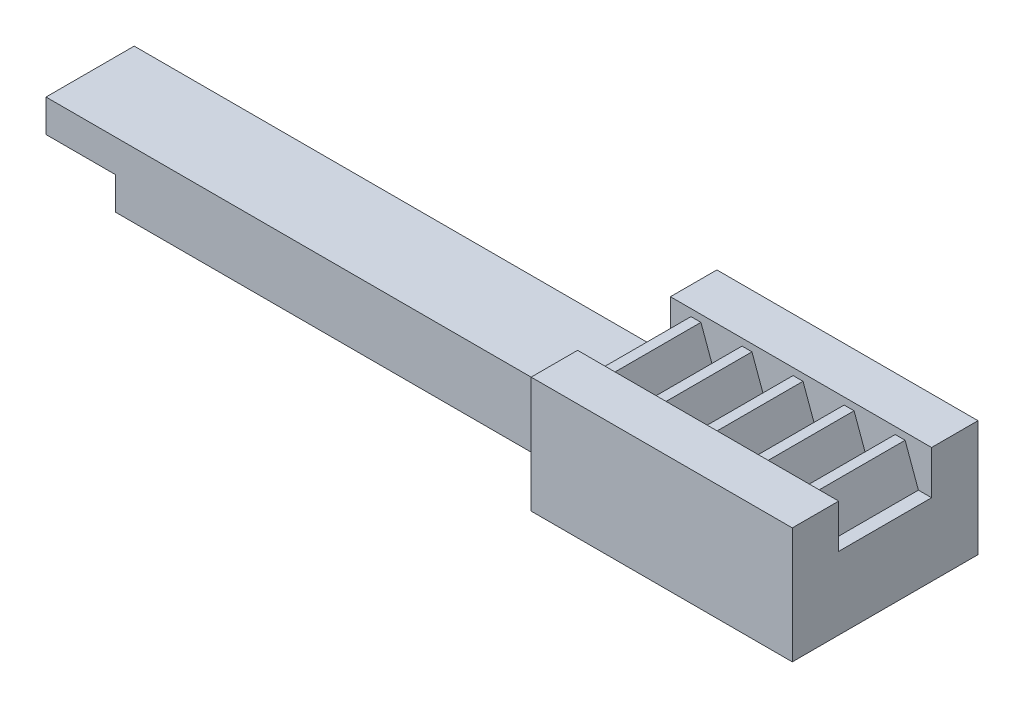
ISO-10303-21;
HEADER;
FILE_DESCRIPTION(('STEP AP214'),'2;1');
FILE_NAME('part.step','',(''),(''),'','','');
FILE_SCHEMA(('AUTOMOTIVE_DESIGN { 1 0 10303 214 1 1 1 1 }'));
ENDSEC;
DATA;
#1=APPLICATION_CONTEXT('core data for automotive mechanical design processes');
#2=APPLICATION_PROTOCOL_DEFINITION('international standard','automotive_design',2000,#1);
#3=PRODUCT_CONTEXT('',#1,'mechanical');
#4=PRODUCT('Part','Part','',(#3));
#5=PRODUCT_RELATED_PRODUCT_CATEGORY('part','',(#4));
#6=PRODUCT_DEFINITION_FORMATION('','',#4);
#7=PRODUCT_DEFINITION_CONTEXT('part definition',#1,'design');
#8=PRODUCT_DEFINITION('design','',#6,#7);
#9=PRODUCT_DEFINITION_SHAPE('','',#8);
#10=(LENGTH_UNIT() NAMED_UNIT(*) SI_UNIT(.MILLI.,.METRE.));
#11=(NAMED_UNIT(*) PLANE_ANGLE_UNIT() SI_UNIT($,.RADIAN.));
#12=(NAMED_UNIT(*) SI_UNIT($,.STERADIAN.) SOLID_ANGLE_UNIT());
#13=UNCERTAINTY_MEASURE_WITH_UNIT(LENGTH_MEASURE(1.E-05),#10,'distance_accuracy_value','');
#14=(GEOMETRIC_REPRESENTATION_CONTEXT(3) GLOBAL_UNCERTAINTY_ASSIGNED_CONTEXT((#13)) GLOBAL_UNIT_ASSIGNED_CONTEXT((#10,
#11,#12)) REPRESENTATION_CONTEXT('',''));
#15=CARTESIAN_POINT('',(0.,0.,0.));
#16=DIRECTION('',(0.,0.,1.));
#17=DIRECTION('',(1.,0.,0.));
#18=AXIS2_PLACEMENT_3D('',#15,#16,#17);
#19=CARTESIAN_POINT('',(0.,0.,-8.));
#20=DIRECTION('',(-1.,0.,0.));
#21=DIRECTION('',(0.,0.,1.));
#22=AXIS2_PLACEMENT_3D('',#19,#20,#21);
#23=PLANE('',#22);
#24=DIRECTION('',(0.,0.,1.));
#25=VECTOR('',#24,1.);
#26=CARTESIAN_POINT('',(0.,0.,-8.));
#27=LINE('',#26,#25);
#28=CARTESIAN_POINT('',(0.,0.,-8.));
#29=VERTEX_POINT('',#28);
#30=CARTESIAN_POINT('',(0.,0.,0.));
#31=VERTEX_POINT('',#30);
#32=EDGE_CURVE('E600',#29,#31,#27,.T.);
#33=ORIENTED_EDGE('',*,*,#32,.T.);
#34=DIRECTION('',(0.,-1.,0.));
#35=VECTOR('',#34,1.);
#36=CARTESIAN_POINT('',(0.,0.,0.));
#37=LINE('',#36,#35);
#38=CARTESIAN_POINT('',(0.,5.,0.));
#39=VERTEX_POINT('',#38);
#40=EDGE_CURVE('E591',#39,#31,#37,.T.);
#41=ORIENTED_EDGE('',*,*,#40,.F.);
#42=DIRECTION('',(0.,0.,-1.));
#43=VECTOR('',#42,1.);
#44=CARTESIAN_POINT('',(0.,5.,0.));
#45=LINE('',#44,#43);
#46=CARTESIAN_POINT('',(0.,5.,-2.));
#47=VERTEX_POINT('',#46);
#48=EDGE_CURVE('E329',#39,#47,#45,.T.);
#49=ORIENTED_EDGE('',*,*,#48,.T.);
#50=DIRECTION('',(0.,-1.,0.));
#51=VECTOR('',#50,1.);
#52=CARTESIAN_POINT('',(0.,5.,-2.));
#53=LINE('',#52,#51);
#54=CARTESIAN_POINT('',(0.,3.12499999999974,-2.));
#55=VERTEX_POINT('',#54);
#56=EDGE_CURVE('E341',#47,#55,#53,.T.);
#57=ORIENTED_EDGE('',*,*,#56,.T.);
#58=DIRECTION('',(0.,0.,1.));
#59=VECTOR('',#58,1.);
#60=CARTESIAN_POINT('',(0.,3.12499999999974,-8.));
#61=LINE('',#60,#59);
#62=CARTESIAN_POINT('',(0.,3.12499999999974,-6.));
#63=VERTEX_POINT('',#62);
#64=EDGE_CURVE('E583',#63,#55,#61,.T.);
#65=ORIENTED_EDGE('',*,*,#64,.F.);
#66=DIRECTION('',(0.,-1.,0.));
#67=VECTOR('',#66,1.);
#68=CARTESIAN_POINT('',(0.,5.,-6.));
#69=LINE('',#68,#67);
#70=CARTESIAN_POINT('',(0.,5.,-6.));
#71=VERTEX_POINT('',#70);
#72=EDGE_CURVE('E328',#71,#63,#69,.T.);
#73=ORIENTED_EDGE('',*,*,#72,.F.);
#74=DIRECTION('',(0.,0.,-1.));
#75=VECTOR('',#74,1.);
#76=CARTESIAN_POINT('',(0.,5.,-6.));
#77=LINE('',#76,#75);
#78=CARTESIAN_POINT('',(0.,5.,-8.));
#79=VERTEX_POINT('',#78);
#80=EDGE_CURVE('E352',#71,#79,#77,.T.);
#81=ORIENTED_EDGE('',*,*,#80,.T.);
#82=DIRECTION('',(0.,-1.,0.));
#83=VECTOR('',#82,1.);
#84=CARTESIAN_POINT('',(0.,0.,-8.));
#85=LINE('',#84,#83);
#86=EDGE_CURVE('E592',#79,#29,#85,.T.);
#87=ORIENTED_EDGE('',*,*,#86,.T.);
#88=EDGE_LOOP('',(#33,#41,#49,#57,#65,#73,#81,#87));
#89=FACE_BOUND('',#88,.T.);
#90=DIRECTION('',(0.,0.,1.));
#91=VECTOR('',#90,1.);
#92=CARTESIAN_POINT('',(0.,2.9,-2.1));
#93=LINE('',#92,#91);
#94=CARTESIAN_POINT('',(0.,2.9,-5.9));
#95=VERTEX_POINT('',#94);
#96=CARTESIAN_POINT('',(0.,2.9,-2.1));
#97=VERTEX_POINT('',#96);
#98=EDGE_CURVE('E1044',#95,#97,#93,.T.);
#99=ORIENTED_EDGE('',*,*,#98,.T.);
#100=DIRECTION('',(0.,-1.,0.));
#101=VECTOR('',#100,1.);
#102=CARTESIAN_POINT('',(0.,0.1,-2.1));
#103=LINE('',#102,#101);
#104=CARTESIAN_POINT('',(0.,0.1,-2.1));
#105=VERTEX_POINT('',#104);
#106=EDGE_CURVE('E68',#97,#105,#103,.T.);
#107=ORIENTED_EDGE('',*,*,#106,.T.);
#108=DIRECTION('',(0.,0.,-1.));
#109=VECTOR('',#108,1.);
#110=CARTESIAN_POINT('',(0.,0.1,-2.1));
#111=LINE('',#110,#109);
#112=CARTESIAN_POINT('',(0.,0.1,-5.9));
#113=VERTEX_POINT('',#112);
#114=EDGE_CURVE('E1050',#105,#113,#111,.T.);
#115=ORIENTED_EDGE('',*,*,#114,.T.);
#116=DIRECTION('',(0.,1.,0.));
#117=VECTOR('',#116,1.);
#118=CARTESIAN_POINT('',(0.,0.1,-5.9));
#119=LINE('',#118,#117);
#120=EDGE_CURVE('E290',#113,#95,#119,.T.);
#121=ORIENTED_EDGE('',*,*,#120,.T.);
#122=EDGE_LOOP('',(#99,#107,#115,#121));
#123=FACE_BOUND('',#122,.T.);
#124=ADVANCED_FACE('F45',(#89,#123),#23,.T.);
#125=CARTESIAN_POINT('',(0.,0.,-8.));
#126=DIRECTION('',(0.,-1.,0.));
#127=DIRECTION('',(0.,0.,-1.));
#128=AXIS2_PLACEMENT_3D('',#125,#126,#127);
#129=PLANE('',#128);
#130=DIRECTION('',(1.,0.,0.));
#131=VECTOR('',#130,1.);
#132=CARTESIAN_POINT('',(0.,0.,-8.));
#133=LINE('',#132,#131);
#134=CARTESIAN_POINT('',(11.25,0.,-8.));
#135=VERTEX_POINT('',#134);
#136=EDGE_CURVE('E595',#29,#135,#133,.T.);
#137=ORIENTED_EDGE('',*,*,#136,.T.);
#138=DIRECTION('',(0.,0.,1.));
#139=VECTOR('',#138,1.);
#140=CARTESIAN_POINT('',(11.25,0.,0.));
#141=LINE('',#140,#139);
#142=CARTESIAN_POINT('',(11.25,0.,0.));
#143=VERTEX_POINT('',#142);
#144=EDGE_CURVE('E307',#135,#143,#141,.T.);
#145=ORIENTED_EDGE('',*,*,#144,.T.);
#146=DIRECTION('',(1.,0.,0.));
#147=VECTOR('',#146,1.);
#148=CARTESIAN_POINT('',(0.,0.,0.));
#149=LINE('',#148,#147);
#150=EDGE_CURVE('E596',#31,#143,#149,.T.);
#151=ORIENTED_EDGE('',*,*,#150,.F.);
#152=ORIENTED_EDGE('',*,*,#32,.F.);
#153=EDGE_LOOP('',(#137,#145,#151,#152));
#154=FACE_BOUND('',#153,.T.);
#155=ADVANCED_FACE('F709',(#154),#129,.T.);
#156=CARTESIAN_POINT('',(0.,4.70000000000021,-8.));
#157=DIRECTION('',(0.,0.,-1.));
#158=DIRECTION('',(-1.,0.,0.));
#159=AXIS2_PLACEMENT_3D('',#156,#157,#158);
#160=PLANE('',#159);
#161=DIRECTION('',(1.,0.,0.));
#162=VECTOR('',#161,1.);
#163=CARTESIAN_POINT('',(0.,5.,-8.));
#164=LINE('',#163,#162);
#165=CARTESIAN_POINT('',(11.25,5.,-8.));
#166=VERTEX_POINT('',#165);
#167=EDGE_CURVE('E348',#79,#166,#164,.T.);
#168=ORIENTED_EDGE('',*,*,#167,.T.);
#169=DIRECTION('',(0.,-1.,0.));
#170=VECTOR('',#169,1.);
#171=CARTESIAN_POINT('',(11.25,5.,-8.));
#172=LINE('',#171,#170);
#173=EDGE_CURVE('E313',#166,#135,#172,.T.);
#174=ORIENTED_EDGE('',*,*,#173,.T.);
#175=ORIENTED_EDGE('',*,*,#136,.F.);
#176=ORIENTED_EDGE('',*,*,#86,.F.);
#177=EDGE_LOOP('',(#168,#174,#175,#176));
#178=FACE_BOUND('',#177,.T.);
#179=ADVANCED_FACE('F713',(#178),#160,.T.);
#180=CARTESIAN_POINT('',(0.,4.70000000000021,0.));
#181=DIRECTION('',(0.,0.,-1.));
#182=DIRECTION('',(-1.,0.,0.));
#183=AXIS2_PLACEMENT_3D('',#180,#181,#182);
#184=PLANE('',#183);
#185=DIRECTION('',(0.,-1.,0.));
#186=VECTOR('',#185,1.);
#187=CARTESIAN_POINT('',(11.25,5.,0.));
#188=LINE('',#187,#186);
#189=CARTESIAN_POINT('',(11.25,5.,0.));
#190=VERTEX_POINT('',#189);
#191=EDGE_CURVE('E306',#190,#143,#188,.T.);
#192=ORIENTED_EDGE('',*,*,#191,.F.);
#193=DIRECTION('',(-1.,0.,0.));
#194=VECTOR('',#193,1.);
#195=CARTESIAN_POINT('',(0.,5.,0.));
#196=LINE('',#195,#194);
#197=EDGE_CURVE('E338',#190,#39,#196,.T.);
#198=ORIENTED_EDGE('',*,*,#197,.T.);
#199=ORIENTED_EDGE('',*,*,#40,.T.);
#200=ORIENTED_EDGE('',*,*,#150,.T.);
#201=EDGE_LOOP('',(#192,#198,#199,#200));
#202=FACE_BOUND('',#201,.T.);
#203=ADVANCED_FACE('F705',(#202),#184,.F.);
#204=CARTESIAN_POINT('',(11.3078790337704,3.12499999999974,-8.));
#205=DIRECTION('',(0.,-1.,0.));
#206=DIRECTION('',(0.,0.,-1.));
#207=AXIS2_PLACEMENT_3D('',#204,#205,#206);
#208=PLANE('',#207);
#209=DIRECTION('',(0.,0.,1.));
#210=VECTOR('',#209,1.);
#211=CARTESIAN_POINT('',(11.25,3.12499999999974,-8.));
#212=LINE('',#211,#210);
#213=CARTESIAN_POINT('',(11.25,3.12499999999974,-6.));
#214=VERTEX_POINT('',#213);
#215=CARTESIAN_POINT('',(11.25,3.12499999999974,-2.));
#216=VERTEX_POINT('',#215);
#217=EDGE_CURVE('E321',#214,#216,#212,.T.);
#218=ORIENTED_EDGE('',*,*,#217,.F.);
#219=DIRECTION('',(-1.,0.,0.));
#220=VECTOR('',#219,1.);
#221=CARTESIAN_POINT('',(11.3078790337704,3.12499999999974,-6.));
#222=LINE('',#221,#220);
#223=CARTESIAN_POINT('',(10.6832695162362,3.12499999999974,-6.));
#224=VERTEX_POINT('',#223);
#225=EDGE_CURVE('E609',#214,#224,#222,.T.);
#226=ORIENTED_EDGE('',*,*,#225,.T.);
#227=DIRECTION('',(0.,0.,1.));
#228=VECTOR('',#227,1.);
#229=CARTESIAN_POINT('',(10.6832695162362,3.12499999999974,-8.));
#230=LINE('',#229,#228);
#231=CARTESIAN_POINT('',(10.6832695162362,3.12499999999974,-2.));
#232=VERTEX_POINT('',#231);
#233=EDGE_CURVE('E507',#224,#232,#230,.T.);
#234=ORIENTED_EDGE('',*,*,#233,.T.);
#235=DIRECTION('',(1.,0.,0.));
#236=VECTOR('',#235,1.);
#237=CARTESIAN_POINT('',(11.3078790337704,3.12499999999974,-2.));
#238=LINE('',#237,#236);
#239=EDGE_CURVE('E53',#232,#216,#238,.T.);
#240=ORIENTED_EDGE('',*,*,#239,.T.);
#241=EDGE_LOOP('',(#218,#226,#234,#240));
#242=FACE_BOUND('',#241,.T.);
#243=ADVANCED_FACE('F615',(#242),#208,.F.);
#244=CARTESIAN_POINT('',(0.,5.,-6.));
#245=DIRECTION('',(0.,0.,1.));
#246=DIRECTION('',(1.,0.,0.));
#247=AXIS2_PLACEMENT_3D('',#244,#245,#246);
#248=PLANE('',#247);
#249=ORIENTED_EDGE('',*,*,#225,.F.);
#250=DIRECTION('',(0.,1.,0.));
#251=VECTOR('',#250,1.);
#252=CARTESIAN_POINT('',(11.25,5.,-6.));
#253=LINE('',#252,#251);
#254=CARTESIAN_POINT('',(11.25,5.,-6.));
#255=VERTEX_POINT('',#254);
#256=EDGE_CURVE('E324',#214,#255,#253,.T.);
#257=ORIENTED_EDGE('',*,*,#256,.T.);
#258=DIRECTION('',(-1.,0.,0.));
#259=VECTOR('',#258,1.);
#260=CARTESIAN_POINT('',(0.,5.,-6.));
#261=LINE('',#260,#259);
#262=EDGE_CURVE('E334',#255,#71,#261,.T.);
#263=ORIENTED_EDGE('',*,*,#262,.T.);
#264=ORIENTED_EDGE('',*,*,#72,.T.);
#265=DIRECTION('',(-1.,0.,0.));
#266=VECTOR('',#265,1.);
#267=CARTESIAN_POINT('',(0.312304758767148,3.12499999999974,-6.));
#268=LINE('',#267,#266);
#269=CARTESIAN_POINT('',(0.312304758767148,3.12499999999974,-6.));
#270=VERTEX_POINT('',#269);
#271=EDGE_CURVE('E428',#270,#63,#268,.T.);
#272=ORIENTED_EDGE('',*,*,#271,.F.);
#273=DIRECTION('',(-0.342020143325663,-0.939692620785911,0.));
#274=VECTOR('',#273,1.);
#275=CARTESIAN_POINT('',(0.894802721686939,4.72540000000021,-6.));
#276=LINE('',#275,#274);
#277=CARTESIAN_POINT('',(0.885557877736578,4.70000000000021,-6.));
#278=VERTEX_POINT('',#277);
#279=EDGE_CURVE('E424',#278,#270,#276,.T.);
#280=ORIENTED_EDGE('',*,*,#279,.F.);
#281=DIRECTION('',(1.,0.,0.));
#282=VECTOR('',#281,1.);
#283=CARTESIAN_POINT('',(0.,4.70000000000021,-6.));
#284=LINE('',#283,#282);
#285=CARTESIAN_POINT('',(1.31355697726408,4.70000000000021,-6.));
#286=VERTEX_POINT('',#285);
#287=EDGE_CURVE('E421',#278,#286,#284,.T.);
#288=ORIENTED_EDGE('',*,*,#287,.T.);
#289=DIRECTION('',(-0.342020143325663,0.939692620785911,0.));
#290=VECTOR('',#289,1.);
#291=CARTESIAN_POINT('',(1.30431213331372,4.72540000000021,-6.));
#292=LINE('',#291,#290);
#293=CARTESIAN_POINT('',(1.88681009623351,3.12499999999974,-6.));
#294=VERTEX_POINT('',#293);
#295=EDGE_CURVE('E417',#294,#286,#292,.T.);
#296=ORIENTED_EDGE('',*,*,#295,.F.);
#297=DIRECTION('',(-1.,0.,0.));
#298=VECTOR('',#297,1.);
#299=CARTESIAN_POINT('',(2.51141961376781,3.12499999999974,-6.));
#300=LINE('',#299,#298);
#301=CARTESIAN_POINT('',(2.51141961376781,3.12499999999974,-6.));
#302=VERTEX_POINT('',#301);
#303=EDGE_CURVE('E413',#302,#294,#300,.T.);
#304=ORIENTED_EDGE('',*,*,#303,.F.);
#305=DIRECTION('',(-0.342020143325663,-0.939692620785911,0.));
#306=VECTOR('',#305,1.);
#307=CARTESIAN_POINT('',(3.0939175766876,4.72540000000021,-6.));
#308=LINE('',#307,#306);
#309=CARTESIAN_POINT('',(3.08467273273724,4.70000000000021,-6.));
#310=VERTEX_POINT('',#309);
#311=EDGE_CURVE('E409',#310,#302,#308,.T.);
#312=ORIENTED_EDGE('',*,*,#311,.F.);
#313=DIRECTION('',(1.,0.,0.));
#314=VECTOR('',#313,1.);
#315=CARTESIAN_POINT('',(0.,4.70000000000021,-6.));
#316=LINE('',#315,#314);
#317=CARTESIAN_POINT('',(3.51267183226474,4.70000000000021,-6.));
#318=VERTEX_POINT('',#317);
#319=EDGE_CURVE('E406',#310,#318,#316,.T.);
#320=ORIENTED_EDGE('',*,*,#319,.T.);
#321=DIRECTION('',(-0.342020143325663,0.939692620785911,0.));
#322=VECTOR('',#321,1.);
#323=CARTESIAN_POINT('',(3.50342698831438,4.72540000000021,-6.));
#324=LINE('',#323,#322);
#325=CARTESIAN_POINT('',(4.08592495123417,3.12499999999974,-6.));
#326=VERTEX_POINT('',#325);
#327=EDGE_CURVE('E402',#326,#318,#324,.T.);
#328=ORIENTED_EDGE('',*,*,#327,.F.);
#329=DIRECTION('',(-1.,0.,0.));
#330=VECTOR('',#329,1.);
#331=CARTESIAN_POINT('',(4.71053446876847,3.12499999999974,-6.));
#332=LINE('',#331,#330);
#333=CARTESIAN_POINT('',(4.71053446876847,3.12499999999974,-6.));
#334=VERTEX_POINT('',#333);
#335=EDGE_CURVE('E398',#334,#326,#332,.T.);
#336=ORIENTED_EDGE('',*,*,#335,.F.);
#337=DIRECTION('',(-0.342020143325663,-0.939692620785911,0.));
#338=VECTOR('',#337,1.);
#339=CARTESIAN_POINT('',(5.29303243168826,4.72540000000021,-6.));
#340=LINE('',#339,#338);
#341=CARTESIAN_POINT('',(5.2837875877379,4.70000000000021,-6.));
#342=VERTEX_POINT('',#341);
#343=EDGE_CURVE('E394',#342,#334,#340,.T.);
#344=ORIENTED_EDGE('',*,*,#343,.F.);
#345=DIRECTION('',(1.,0.,0.));
#346=VECTOR('',#345,1.);
#347=CARTESIAN_POINT('',(0.,4.70000000000021,-6.));
#348=LINE('',#347,#346);
#349=CARTESIAN_POINT('',(5.7117866872654,4.70000000000021,-6.));
#350=VERTEX_POINT('',#349);
#351=EDGE_CURVE('E391',#342,#350,#348,.T.);
#352=ORIENTED_EDGE('',*,*,#351,.T.);
#353=DIRECTION('',(-0.342020143325663,0.939692620785911,0.));
#354=VECTOR('',#353,1.);
#355=CARTESIAN_POINT('',(5.70254184331504,4.72540000000021,-6.));
#356=LINE('',#355,#354);
#357=CARTESIAN_POINT('',(6.28503980623483,3.12499999999974,-6.));
#358=VERTEX_POINT('',#357);
#359=EDGE_CURVE('E387',#358,#350,#356,.T.);
#360=ORIENTED_EDGE('',*,*,#359,.F.);
#361=DIRECTION('',(-1.,0.,0.));
#362=VECTOR('',#361,1.);
#363=CARTESIAN_POINT('',(6.90964932376913,3.12499999999974,-6.));
#364=LINE('',#363,#362);
#365=CARTESIAN_POINT('',(6.90964932376913,3.12499999999974,-6.));
#366=VERTEX_POINT('',#365);
#367=EDGE_CURVE('E383',#366,#358,#364,.T.);
#368=ORIENTED_EDGE('',*,*,#367,.F.);
#369=DIRECTION('',(-0.342020143325663,-0.939692620785911,0.));
#370=VECTOR('',#369,1.);
#371=CARTESIAN_POINT('',(7.49214728668892,4.72540000000021,-6.));
#372=LINE('',#371,#370);
#373=CARTESIAN_POINT('',(7.48290244273856,4.70000000000021,-6.));
#374=VERTEX_POINT('',#373);
#375=EDGE_CURVE('E379',#374,#366,#372,.T.);
#376=ORIENTED_EDGE('',*,*,#375,.F.);
#377=DIRECTION('',(1.,0.,0.));
#378=VECTOR('',#377,1.);
#379=CARTESIAN_POINT('',(0.,4.70000000000021,-6.));
#380=LINE('',#379,#378);
#381=CARTESIAN_POINT('',(7.91090154226606,4.70000000000021,-6.));
#382=VERTEX_POINT('',#381);
#383=EDGE_CURVE('E376',#374,#382,#380,.T.);
#384=ORIENTED_EDGE('',*,*,#383,.T.);
#385=DIRECTION('',(-0.342020143325663,0.939692620785911,0.));
#386=VECTOR('',#385,1.);
#387=CARTESIAN_POINT('',(7.9016566983157,4.72540000000021,-6.));
#388=LINE('',#387,#386);
#389=CARTESIAN_POINT('',(8.48415466123549,3.12499999999974,-6.));
#390=VERTEX_POINT('',#389);
#391=EDGE_CURVE('E372',#390,#382,#388,.T.);
#392=ORIENTED_EDGE('',*,*,#391,.F.);
#393=DIRECTION('',(-1.,0.,0.));
#394=VECTOR('',#393,1.);
#395=CARTESIAN_POINT('',(9.10876417876979,3.12499999999974,-6.));
#396=LINE('',#395,#394);
#397=CARTESIAN_POINT('',(9.10876417876979,3.12499999999974,-6.));
#398=VERTEX_POINT('',#397);
#399=EDGE_CURVE('E368',#398,#390,#396,.T.);
#400=ORIENTED_EDGE('',*,*,#399,.F.);
#401=DIRECTION('',(-0.342020143325663,-0.939692620785911,0.));
#402=VECTOR('',#401,1.);
#403=CARTESIAN_POINT('',(9.69126214168958,4.72540000000021,-6.));
#404=LINE('',#403,#402);
#405=CARTESIAN_POINT('',(9.68201729773922,4.70000000000021,-6.));
#406=VERTEX_POINT('',#405);
#407=EDGE_CURVE('E364',#406,#398,#404,.T.);
#408=ORIENTED_EDGE('',*,*,#407,.F.);
#409=DIRECTION('',(1.,0.,0.));
#410=VECTOR('',#409,1.);
#411=CARTESIAN_POINT('',(0.,4.70000000000021,-6.));
#412=LINE('',#411,#410);
#413=CARTESIAN_POINT('',(10.1100163972667,4.70000000000021,-6.));
#414=VERTEX_POINT('',#413);
#415=EDGE_CURVE('E361',#406,#414,#412,.T.);
#416=ORIENTED_EDGE('',*,*,#415,.T.);
#417=DIRECTION('',(-0.342020143325663,0.939692620785911,0.));
#418=VECTOR('',#417,1.);
#419=CARTESIAN_POINT('',(10.1007715533164,4.72540000000021,-6.));
#420=LINE('',#419,#418);
#421=EDGE_CURVE('E345',#224,#414,#420,.T.);
#422=ORIENTED_EDGE('',*,*,#421,.F.);
#423=EDGE_LOOP('',(#249,#257,#263,#264,#272,#280,#288,#296,#304,#312,#320,#328,#336,#344,#352,
#360,#368,#376,#384,#392,#400,#408,#416,#422));
#424=FACE_BOUND('',#423,.T.);
#425=ADVANCED_FACE('F720',(#424),#248,.T.);
#426=CARTESIAN_POINT('',(0.,5.,0.));
#427=DIRECTION('',(0.,-1.,0.));
#428=DIRECTION('',(0.,0.,-1.));
#429=AXIS2_PLACEMENT_3D('',#426,#427,#428);
#430=PLANE('',#429);
#431=DIRECTION('',(0.,0.,1.));
#432=VECTOR('',#431,1.);
#433=CARTESIAN_POINT('',(11.25,5.,0.));
#434=LINE('',#433,#432);
#435=EDGE_CURVE('E303',#166,#255,#434,.T.);
#436=ORIENTED_EDGE('',*,*,#435,.F.);
#437=ORIENTED_EDGE('',*,*,#167,.F.);
#438=ORIENTED_EDGE('',*,*,#80,.F.);
#439=ORIENTED_EDGE('',*,*,#262,.F.);
#440=EDGE_LOOP('',(#436,#437,#438,#439));
#441=FACE_BOUND('',#440,.T.);
#442=ADVANCED_FACE('F717',(#441),#430,.F.);
#443=CARTESIAN_POINT('',(0.,5.,-2.));
#444=DIRECTION('',(0.,0.,-1.));
#445=DIRECTION('',(-1.,0.,0.));
#446=AXIS2_PLACEMENT_3D('',#443,#444,#445);
#447=PLANE('',#446);
#448=DIRECTION('',(1.,0.,0.));
#449=VECTOR('',#448,1.);
#450=CARTESIAN_POINT('',(0.,5.,-2.));
#451=LINE('',#450,#449);
#452=CARTESIAN_POINT('',(11.25,5.,-2.));
#453=VERTEX_POINT('',#452);
#454=EDGE_CURVE('E333',#47,#453,#451,.T.);
#455=ORIENTED_EDGE('',*,*,#454,.T.);
#456=DIRECTION('',(0.,-1.,0.));
#457=VECTOR('',#456,1.);
#458=CARTESIAN_POINT('',(11.25,5.,-2.));
#459=LINE('',#458,#457);
#460=EDGE_CURVE('E317',#453,#216,#459,.T.);
#461=ORIENTED_EDGE('',*,*,#460,.T.);
#462=ORIENTED_EDGE('',*,*,#239,.F.);
#463=DIRECTION('',(0.342020143325663,-0.939692620785911,0.));
#464=VECTOR('',#463,1.);
#465=CARTESIAN_POINT('',(10.1007715533164,4.72540000000021,-2.));
#466=LINE('',#465,#464);
#467=CARTESIAN_POINT('',(10.1100163972667,4.70000000000021,-2.));
#468=VERTEX_POINT('',#467);
#469=EDGE_CURVE('E432',#468,#232,#466,.T.);
#470=ORIENTED_EDGE('',*,*,#469,.F.);
#471=DIRECTION('',(-1.,0.,0.));
#472=VECTOR('',#471,1.);
#473=CARTESIAN_POINT('',(0.,4.70000000000021,-2.));
#474=LINE('',#473,#472);
#475=CARTESIAN_POINT('',(9.68201729773922,4.70000000000021,-2.));
#476=VERTEX_POINT('',#475);
#477=EDGE_CURVE('E436',#468,#476,#474,.T.);
#478=ORIENTED_EDGE('',*,*,#477,.T.);
#479=DIRECTION('',(0.342020143325663,0.939692620785911,0.));
#480=VECTOR('',#479,1.);
#481=CARTESIAN_POINT('',(9.69126214168958,4.72540000000021,-2.));
#482=LINE('',#481,#480);
#483=CARTESIAN_POINT('',(9.10876417876979,3.12499999999974,-2.));
#484=VERTEX_POINT('',#483);
#485=EDGE_CURVE('E439',#484,#476,#482,.T.);
#486=ORIENTED_EDGE('',*,*,#485,.F.);
#487=DIRECTION('',(1.,0.,0.));
#488=VECTOR('',#487,1.);
#489=CARTESIAN_POINT('',(9.10876417876979,3.12499999999974,-2.));
#490=LINE('',#489,#488);
#491=CARTESIAN_POINT('',(8.48415466123549,3.12499999999974,-2.));
#492=VERTEX_POINT('',#491);
#493=EDGE_CURVE('E443',#492,#484,#490,.T.);
#494=ORIENTED_EDGE('',*,*,#493,.F.);
#495=DIRECTION('',(0.342020143325663,-0.939692620785911,0.));
#496=VECTOR('',#495,1.);
#497=CARTESIAN_POINT('',(7.9016566983157,4.72540000000021,-2.));
#498=LINE('',#497,#496);
#499=CARTESIAN_POINT('',(7.91090154226606,4.70000000000021,-2.));
#500=VERTEX_POINT('',#499);
#501=EDGE_CURVE('E447',#500,#492,#498,.T.);
#502=ORIENTED_EDGE('',*,*,#501,.F.);
#503=DIRECTION('',(-1.,0.,0.));
#504=VECTOR('',#503,1.);
#505=CARTESIAN_POINT('',(0.,4.70000000000021,-2.));
#506=LINE('',#505,#504);
#507=CARTESIAN_POINT('',(7.48290244273856,4.70000000000021,-2.));
#508=VERTEX_POINT('',#507);
#509=EDGE_CURVE('E451',#500,#508,#506,.T.);
#510=ORIENTED_EDGE('',*,*,#509,.T.);
#511=DIRECTION('',(0.342020143325663,0.939692620785911,0.));
#512=VECTOR('',#511,1.);
#513=CARTESIAN_POINT('',(7.49214728668892,4.72540000000021,-2.));
#514=LINE('',#513,#512);
#515=CARTESIAN_POINT('',(6.90964932376913,3.12499999999974,-2.));
#516=VERTEX_POINT('',#515);
#517=EDGE_CURVE('E454',#516,#508,#514,.T.);
#518=ORIENTED_EDGE('',*,*,#517,.F.);
#519=DIRECTION('',(1.,0.,0.));
#520=VECTOR('',#519,1.);
#521=CARTESIAN_POINT('',(6.90964932376913,3.12499999999974,-2.));
#522=LINE('',#521,#520);
#523=CARTESIAN_POINT('',(6.28503980623483,3.12499999999974,-2.));
#524=VERTEX_POINT('',#523);
#525=EDGE_CURVE('E458',#524,#516,#522,.T.);
#526=ORIENTED_EDGE('',*,*,#525,.F.);
#527=DIRECTION('',(0.342020143325663,-0.939692620785911,0.));
#528=VECTOR('',#527,1.);
#529=CARTESIAN_POINT('',(5.70254184331504,4.72540000000021,-2.));
#530=LINE('',#529,#528);
#531=CARTESIAN_POINT('',(5.7117866872654,4.70000000000021,-2.));
#532=VERTEX_POINT('',#531);
#533=EDGE_CURVE('E462',#532,#524,#530,.T.);
#534=ORIENTED_EDGE('',*,*,#533,.F.);
#535=DIRECTION('',(-1.,0.,0.));
#536=VECTOR('',#535,1.);
#537=CARTESIAN_POINT('',(0.,4.70000000000021,-2.));
#538=LINE('',#537,#536);
#539=CARTESIAN_POINT('',(5.2837875877379,4.70000000000021,-2.));
#540=VERTEX_POINT('',#539);
#541=EDGE_CURVE('E466',#532,#540,#538,.T.);
#542=ORIENTED_EDGE('',*,*,#541,.T.);
#543=DIRECTION('',(0.342020143325663,0.939692620785911,0.));
#544=VECTOR('',#543,1.);
#545=CARTESIAN_POINT('',(5.29303243168826,4.72540000000021,-2.));
#546=LINE('',#545,#544);
#547=CARTESIAN_POINT('',(4.71053446876847,3.12499999999974,-2.));
#548=VERTEX_POINT('',#547);
#549=EDGE_CURVE('E469',#548,#540,#546,.T.);
#550=ORIENTED_EDGE('',*,*,#549,.F.);
#551=DIRECTION('',(1.,0.,0.));
#552=VECTOR('',#551,1.);
#553=CARTESIAN_POINT('',(4.71053446876847,3.12499999999974,-2.));
#554=LINE('',#553,#552);
#555=CARTESIAN_POINT('',(4.08592495123417,3.12499999999974,-2.));
#556=VERTEX_POINT('',#555);
#557=EDGE_CURVE('E473',#556,#548,#554,.T.);
#558=ORIENTED_EDGE('',*,*,#557,.F.);
#559=DIRECTION('',(0.342020143325663,-0.939692620785911,0.));
#560=VECTOR('',#559,1.);
#561=CARTESIAN_POINT('',(3.50342698831438,4.72540000000021,-2.));
#562=LINE('',#561,#560);
#563=CARTESIAN_POINT('',(3.51267183226474,4.70000000000021,-2.));
#564=VERTEX_POINT('',#563);
#565=EDGE_CURVE('E477',#564,#556,#562,.T.);
#566=ORIENTED_EDGE('',*,*,#565,.F.);
#567=DIRECTION('',(-1.,0.,0.));
#568=VECTOR('',#567,1.);
#569=CARTESIAN_POINT('',(0.,4.70000000000021,-2.));
#570=LINE('',#569,#568);
#571=CARTESIAN_POINT('',(3.08467273273724,4.70000000000021,-2.));
#572=VERTEX_POINT('',#571);
#573=EDGE_CURVE('E481',#564,#572,#570,.T.);
#574=ORIENTED_EDGE('',*,*,#573,.T.);
#575=DIRECTION('',(0.342020143325663,0.939692620785911,0.));
#576=VECTOR('',#575,1.);
#577=CARTESIAN_POINT('',(3.0939175766876,4.72540000000021,-2.));
#578=LINE('',#577,#576);
#579=CARTESIAN_POINT('',(2.51141961376781,3.12499999999974,-2.));
#580=VERTEX_POINT('',#579);
#581=EDGE_CURVE('E484',#580,#572,#578,.T.);
#582=ORIENTED_EDGE('',*,*,#581,.F.);
#583=DIRECTION('',(1.,0.,0.));
#584=VECTOR('',#583,1.);
#585=CARTESIAN_POINT('',(2.51141961376781,3.12499999999974,-2.));
#586=LINE('',#585,#584);
#587=CARTESIAN_POINT('',(1.88681009623351,3.12499999999974,-2.));
#588=VERTEX_POINT('',#587);
#589=EDGE_CURVE('E488',#588,#580,#586,.T.);
#590=ORIENTED_EDGE('',*,*,#589,.F.);
#591=DIRECTION('',(0.342020143325663,-0.939692620785911,0.));
#592=VECTOR('',#591,1.);
#593=CARTESIAN_POINT('',(1.30431213331372,4.72540000000021,-2.));
#594=LINE('',#593,#592);
#595=CARTESIAN_POINT('',(1.31355697726408,4.70000000000021,-2.));
#596=VERTEX_POINT('',#595);
#597=EDGE_CURVE('E492',#596,#588,#594,.T.);
#598=ORIENTED_EDGE('',*,*,#597,.F.);
#599=DIRECTION('',(-1.,0.,0.));
#600=VECTOR('',#599,1.);
#601=CARTESIAN_POINT('',(0.,4.70000000000021,-2.));
#602=LINE('',#601,#600);
#603=CARTESIAN_POINT('',(0.885557877736578,4.70000000000021,-2.));
#604=VERTEX_POINT('',#603);
#605=EDGE_CURVE('E496',#596,#604,#602,.T.);
#606=ORIENTED_EDGE('',*,*,#605,.T.);
#607=DIRECTION('',(0.342020143325663,0.939692620785911,0.));
#608=VECTOR('',#607,1.);
#609=CARTESIAN_POINT('',(0.894802721686939,4.72540000000021,-2.));
#610=LINE('',#609,#608);
#611=CARTESIAN_POINT('',(0.312304758767148,3.12499999999974,-2.));
#612=VERTEX_POINT('',#611);
#613=EDGE_CURVE('E499',#612,#604,#610,.T.);
#614=ORIENTED_EDGE('',*,*,#613,.F.);
#615=DIRECTION('',(1.,0.,0.));
#616=VECTOR('',#615,1.);
#617=CARTESIAN_POINT('',(0.312304758767148,3.12499999999974,-2.));
#618=LINE('',#617,#616);
#619=EDGE_CURVE('E503',#55,#612,#618,.T.);
#620=ORIENTED_EDGE('',*,*,#619,.F.);
#621=ORIENTED_EDGE('',*,*,#56,.F.);
#622=EDGE_LOOP('',(#455,#461,#462,#470,#478,#486,#494,#502,#510,#518,#526,#534,#542,#550,#558,
#566,#574,#582,#590,#598,#606,#614,#620,#621));
#623=FACE_BOUND('',#622,.T.);
#624=ADVANCED_FACE('F619',(#623),#447,.T.);
#625=CARTESIAN_POINT('',(0.,5.,0.));
#626=DIRECTION('',(0.,-1.,0.));
#627=DIRECTION('',(0.,0.,-1.));
#628=AXIS2_PLACEMENT_3D('',#625,#626,#627);
#629=PLANE('',#628);
#630=DIRECTION('',(0.,0.,1.));
#631=VECTOR('',#630,1.);
#632=CARTESIAN_POINT('',(11.25,5.,0.));
#633=LINE('',#632,#631);
#634=EDGE_CURVE('E11',#453,#190,#633,.T.);
#635=ORIENTED_EDGE('',*,*,#634,.F.);
#636=ORIENTED_EDGE('',*,*,#454,.F.);
#637=ORIENTED_EDGE('',*,*,#48,.F.);
#638=ORIENTED_EDGE('',*,*,#197,.F.);
#639=EDGE_LOOP('',(#635,#636,#637,#638));
#640=FACE_BOUND('',#639,.T.);
#641=ADVANCED_FACE('F700',(#640),#629,.F.);
#642=CARTESIAN_POINT('',(0.,4.70000000000021,-8.));
#643=DIRECTION('',(0.,1.,0.));
#644=DIRECTION('',(0.,0.,1.));
#645=AXIS2_PLACEMENT_3D('',#642,#643,#644);
#646=PLANE('',#645);
#647=ORIENTED_EDGE('',*,*,#477,.F.);
#648=DIRECTION('',(0.,0.,1.));
#649=VECTOR('',#648,1.);
#650=CARTESIAN_POINT('',(10.1100163972667,4.70000000000021,-8.));
#651=LINE('',#650,#649);
#652=EDGE_CURVE('E511',#414,#468,#651,.T.);
#653=ORIENTED_EDGE('',*,*,#652,.F.);
#654=ORIENTED_EDGE('',*,*,#415,.F.);
#655=DIRECTION('',(0.,0.,-1.));
#656=VECTOR('',#655,1.);
#657=CARTESIAN_POINT('',(9.68201729773922,4.70000000000021,-8.));
#658=LINE('',#657,#656);
#659=EDGE_CURVE('E520',#476,#406,#658,.T.);
#660=ORIENTED_EDGE('',*,*,#659,.F.);
#661=EDGE_LOOP('',(#647,#653,#654,#660));
#662=FACE_BOUND('',#661,.T.);
#663=ADVANCED_FACE('F627',(#662),#646,.T.);
#664=ORIENTED_EDGE('',*,*,#509,.F.);
#665=DIRECTION('',(0.,0.,1.));
#666=VECTOR('',#665,1.);
#667=CARTESIAN_POINT('',(7.91090154226606,4.70000000000021,-8.));
#668=LINE('',#667,#666);
#669=EDGE_CURVE('E527',#382,#500,#668,.T.);
#670=ORIENTED_EDGE('',*,*,#669,.F.);
#671=ORIENTED_EDGE('',*,*,#383,.F.);
#672=DIRECTION('',(0.,0.,-1.));
#673=VECTOR('',#672,1.);
#674=CARTESIAN_POINT('',(7.48290244273856,4.70000000000021,-8.));
#675=LINE('',#674,#673);
#676=EDGE_CURVE('E536',#508,#374,#675,.T.);
#677=ORIENTED_EDGE('',*,*,#676,.F.);
#678=EDGE_LOOP('',(#664,#670,#671,#677));
#679=FACE_BOUND('',#678,.T.);
#680=ADVANCED_FACE('F641',(#679),#646,.T.);
#681=ORIENTED_EDGE('',*,*,#541,.F.);
#682=DIRECTION('',(0.,0.,1.));
#683=VECTOR('',#682,1.);
#684=CARTESIAN_POINT('',(5.7117866872654,4.70000000000021,-8.));
#685=LINE('',#684,#683);
#686=EDGE_CURVE('E543',#350,#532,#685,.T.);
#687=ORIENTED_EDGE('',*,*,#686,.F.);
#688=ORIENTED_EDGE('',*,*,#351,.F.);
#689=DIRECTION('',(0.,0.,-1.));
#690=VECTOR('',#689,1.);
#691=CARTESIAN_POINT('',(5.2837875877379,4.70000000000021,-8.));
#692=LINE('',#691,#690);
#693=EDGE_CURVE('E552',#540,#342,#692,.T.);
#694=ORIENTED_EDGE('',*,*,#693,.F.);
#695=EDGE_LOOP('',(#681,#687,#688,#694));
#696=FACE_BOUND('',#695,.T.);
#697=ADVANCED_FACE('F655',(#696),#646,.T.);
#698=ORIENTED_EDGE('',*,*,#573,.F.);
#699=DIRECTION('',(0.,0.,1.));
#700=VECTOR('',#699,1.);
#701=CARTESIAN_POINT('',(3.51267183226474,4.70000000000021,-8.));
#702=LINE('',#701,#700);
#703=EDGE_CURVE('E559',#318,#564,#702,.T.);
#704=ORIENTED_EDGE('',*,*,#703,.F.);
#705=ORIENTED_EDGE('',*,*,#319,.F.);
#706=DIRECTION('',(0.,0.,-1.));
#707=VECTOR('',#706,1.);
#708=CARTESIAN_POINT('',(3.08467273273724,4.70000000000021,-8.));
#709=LINE('',#708,#707);
#710=EDGE_CURVE('E568',#572,#310,#709,.T.);
#711=ORIENTED_EDGE('',*,*,#710,.F.);
#712=EDGE_LOOP('',(#698,#704,#705,#711));
#713=FACE_BOUND('',#712,.T.);
#714=ADVANCED_FACE('F669',(#713),#646,.T.);
#715=ORIENTED_EDGE('',*,*,#605,.F.);
#716=DIRECTION('',(0.,0.,1.));
#717=VECTOR('',#716,1.);
#718=CARTESIAN_POINT('',(1.31355697726408,4.70000000000021,-8.));
#719=LINE('',#718,#717);
#720=EDGE_CURVE('E575',#286,#596,#719,.T.);
#721=ORIENTED_EDGE('',*,*,#720,.F.);
#722=ORIENTED_EDGE('',*,*,#287,.F.);
#723=DIRECTION('',(0.,0.,-1.));
#724=VECTOR('',#723,1.);
#725=CARTESIAN_POINT('',(0.885557877736578,4.70000000000021,-8.));
#726=LINE('',#725,#724);
#727=EDGE_CURVE('E587',#604,#278,#726,.T.);
#728=ORIENTED_EDGE('',*,*,#727,.F.);
#729=EDGE_LOOP('',(#715,#721,#722,#728));
#730=FACE_BOUND('',#729,.T.);
#731=ADVANCED_FACE('F683',(#730),#646,.T.);
#732=CARTESIAN_POINT('',(0.894802721686939,4.72540000000021,-8.));
#733=DIRECTION('',(0.93969262078591,-0.342020143325663,0.));
#734=DIRECTION('',(0.342020143325663,0.939692620785911,0.));
#735=AXIS2_PLACEMENT_3D('',#732,#733,#734);
#736=PLANE('',#735);
#737=DIRECTION('',(0.,0.,1.));
#738=VECTOR('',#737,1.);
#739=CARTESIAN_POINT('',(0.312304758767148,3.12499999999974,-8.));
#740=LINE('',#739,#738);
#741=EDGE_CURVE('E579',#270,#612,#740,.T.);
#742=ORIENTED_EDGE('',*,*,#741,.T.);
#743=ORIENTED_EDGE('',*,*,#613,.T.);
#744=ORIENTED_EDGE('',*,*,#727,.T.);
#745=ORIENTED_EDGE('',*,*,#279,.T.);
#746=EDGE_LOOP('',(#742,#743,#744,#745));
#747=FACE_BOUND('',#746,.T.);
#748=ADVANCED_FACE('F686',(#747),#736,.F.);
#749=CARTESIAN_POINT('',(0.312304758767148,3.12499999999974,-8.));
#750=DIRECTION('',(0.,-1.,0.));
#751=DIRECTION('',(0.,0.,-1.));
#752=AXIS2_PLACEMENT_3D('',#749,#750,#751);
#753=PLANE('',#752);
#754=ORIENTED_EDGE('',*,*,#64,.T.);
#755=ORIENTED_EDGE('',*,*,#619,.T.);
#756=ORIENTED_EDGE('',*,*,#741,.F.);
#757=ORIENTED_EDGE('',*,*,#271,.T.);
#758=EDGE_LOOP('',(#754,#755,#756,#757));
#759=FACE_BOUND('',#758,.T.);
#760=ADVANCED_FACE('F689',(#759),#753,.F.);
#761=CARTESIAN_POINT('',(1.30431213331372,4.72540000000021,-8.));
#762=DIRECTION('',(-0.93969262078591,-0.342020143325663,0.));
#763=DIRECTION('',(0.342020143325663,-0.939692620785911,0.));
#764=AXIS2_PLACEMENT_3D('',#761,#762,#763);
#765=PLANE('',#764);
#766=ORIENTED_EDGE('',*,*,#720,.T.);
#767=ORIENTED_EDGE('',*,*,#597,.T.);
#768=DIRECTION('',(0.,0.,1.));
#769=VECTOR('',#768,1.);
#770=CARTESIAN_POINT('',(1.88681009623351,3.12499999999974,-8.));
#771=LINE('',#770,#769);
#772=EDGE_CURVE('E563',#294,#588,#771,.T.);
#773=ORIENTED_EDGE('',*,*,#772,.F.);
#774=ORIENTED_EDGE('',*,*,#295,.T.);
#775=EDGE_LOOP('',(#766,#767,#773,#774));
#776=FACE_BOUND('',#775,.T.);
#777=ADVANCED_FACE('F679',(#776),#765,.F.);
#778=CARTESIAN_POINT('',(3.0939175766876,4.72540000000021,-8.));
#779=DIRECTION('',(0.93969262078591,-0.342020143325663,0.));
#780=DIRECTION('',(0.342020143325663,0.939692620785911,0.));
#781=AXIS2_PLACEMENT_3D('',#778,#779,#780);
#782=PLANE('',#781);
#783=DIRECTION('',(0.,0.,1.));
#784=VECTOR('',#783,1.);
#785=CARTESIAN_POINT('',(2.51141961376781,3.12499999999974,-8.));
#786=LINE('',#785,#784);
#787=EDGE_CURVE('E564',#302,#580,#786,.T.);
#788=ORIENTED_EDGE('',*,*,#787,.T.);
#789=ORIENTED_EDGE('',*,*,#581,.T.);
#790=ORIENTED_EDGE('',*,*,#710,.T.);
#791=ORIENTED_EDGE('',*,*,#311,.T.);
#792=EDGE_LOOP('',(#788,#789,#790,#791));
#793=FACE_BOUND('',#792,.T.);
#794=ADVANCED_FACE('F672',(#793),#782,.F.);
#795=CARTESIAN_POINT('',(2.51141961376781,3.12499999999974,-8.));
#796=DIRECTION('',(0.,-1.,0.));
#797=DIRECTION('',(0.,0.,-1.));
#798=AXIS2_PLACEMENT_3D('',#795,#796,#797);
#799=PLANE('',#798);
#800=ORIENTED_EDGE('',*,*,#772,.T.);
#801=ORIENTED_EDGE('',*,*,#589,.T.);
#802=ORIENTED_EDGE('',*,*,#787,.F.);
#803=ORIENTED_EDGE('',*,*,#303,.T.);
#804=EDGE_LOOP('',(#800,#801,#802,#803));
#805=FACE_BOUND('',#804,.T.);
#806=ADVANCED_FACE('F675',(#805),#799,.F.);
#807=CARTESIAN_POINT('',(3.50342698831438,4.72540000000021,-8.));
#808=DIRECTION('',(-0.93969262078591,-0.342020143325663,0.));
#809=DIRECTION('',(0.342020143325663,-0.939692620785911,0.));
#810=AXIS2_PLACEMENT_3D('',#807,#808,#809);
#811=PLANE('',#810);
#812=ORIENTED_EDGE('',*,*,#703,.T.);
#813=ORIENTED_EDGE('',*,*,#565,.T.);
#814=DIRECTION('',(0.,0.,1.));
#815=VECTOR('',#814,1.);
#816=CARTESIAN_POINT('',(4.08592495123417,3.12499999999974,-8.));
#817=LINE('',#816,#815);
#818=EDGE_CURVE('E547',#326,#556,#817,.T.);
#819=ORIENTED_EDGE('',*,*,#818,.F.);
#820=ORIENTED_EDGE('',*,*,#327,.T.);
#821=EDGE_LOOP('',(#812,#813,#819,#820));
#822=FACE_BOUND('',#821,.T.);
#823=ADVANCED_FACE('F665',(#822),#811,.F.);
#824=CARTESIAN_POINT('',(5.29303243168826,4.72540000000021,-8.));
#825=DIRECTION('',(0.93969262078591,-0.342020143325663,0.));
#826=DIRECTION('',(0.342020143325663,0.939692620785911,0.));
#827=AXIS2_PLACEMENT_3D('',#824,#825,#826);
#828=PLANE('',#827);
#829=DIRECTION('',(0.,0.,1.));
#830=VECTOR('',#829,1.);
#831=CARTESIAN_POINT('',(4.71053446876847,3.12499999999974,-8.));
#832=LINE('',#831,#830);
#833=EDGE_CURVE('E548',#334,#548,#832,.T.);
#834=ORIENTED_EDGE('',*,*,#833,.T.);
#835=ORIENTED_EDGE('',*,*,#549,.T.);
#836=ORIENTED_EDGE('',*,*,#693,.T.);
#837=ORIENTED_EDGE('',*,*,#343,.T.);
#838=EDGE_LOOP('',(#834,#835,#836,#837));
#839=FACE_BOUND('',#838,.T.);
#840=ADVANCED_FACE('F658',(#839),#828,.F.);
#841=CARTESIAN_POINT('',(4.71053446876847,3.12499999999974,-8.));
#842=DIRECTION('',(0.,-1.,0.));
#843=DIRECTION('',(0.,0.,-1.));
#844=AXIS2_PLACEMENT_3D('',#841,#842,#843);
#845=PLANE('',#844);
#846=ORIENTED_EDGE('',*,*,#818,.T.);
#847=ORIENTED_EDGE('',*,*,#557,.T.);
#848=ORIENTED_EDGE('',*,*,#833,.F.);
#849=ORIENTED_EDGE('',*,*,#335,.T.);
#850=EDGE_LOOP('',(#846,#847,#848,#849));
#851=FACE_BOUND('',#850,.T.);
#852=ADVANCED_FACE('F661',(#851),#845,.F.);
#853=CARTESIAN_POINT('',(5.70254184331504,4.72540000000021,-8.));
#854=DIRECTION('',(-0.93969262078591,-0.342020143325663,0.));
#855=DIRECTION('',(0.342020143325663,-0.939692620785911,0.));
#856=AXIS2_PLACEMENT_3D('',#853,#854,#855);
#857=PLANE('',#856);
#858=ORIENTED_EDGE('',*,*,#686,.T.);
#859=ORIENTED_EDGE('',*,*,#533,.T.);
#860=DIRECTION('',(0.,0.,1.));
#861=VECTOR('',#860,1.);
#862=CARTESIAN_POINT('',(6.28503980623483,3.12499999999974,-8.));
#863=LINE('',#862,#861);
#864=EDGE_CURVE('E531',#358,#524,#863,.T.);
#865=ORIENTED_EDGE('',*,*,#864,.F.);
#866=ORIENTED_EDGE('',*,*,#359,.T.);
#867=EDGE_LOOP('',(#858,#859,#865,#866));
#868=FACE_BOUND('',#867,.T.);
#869=ADVANCED_FACE('F651',(#868),#857,.F.);
#870=CARTESIAN_POINT('',(7.49214728668892,4.72540000000021,-8.));
#871=DIRECTION('',(0.93969262078591,-0.342020143325663,0.));
#872=DIRECTION('',(0.342020143325663,0.939692620785911,0.));
#873=AXIS2_PLACEMENT_3D('',#870,#871,#872);
#874=PLANE('',#873);
#875=DIRECTION('',(0.,0.,1.));
#876=VECTOR('',#875,1.);
#877=CARTESIAN_POINT('',(6.90964932376913,3.12499999999974,-8.));
#878=LINE('',#877,#876);
#879=EDGE_CURVE('E532',#366,#516,#878,.T.);
#880=ORIENTED_EDGE('',*,*,#879,.T.);
#881=ORIENTED_EDGE('',*,*,#517,.T.);
#882=ORIENTED_EDGE('',*,*,#676,.T.);
#883=ORIENTED_EDGE('',*,*,#375,.T.);
#884=EDGE_LOOP('',(#880,#881,#882,#883));
#885=FACE_BOUND('',#884,.T.);
#886=ADVANCED_FACE('F644',(#885),#874,.F.);
#887=CARTESIAN_POINT('',(6.90964932376913,3.12499999999974,-8.));
#888=DIRECTION('',(0.,-1.,0.));
#889=DIRECTION('',(0.,0.,-1.));
#890=AXIS2_PLACEMENT_3D('',#887,#888,#889);
#891=PLANE('',#890);
#892=ORIENTED_EDGE('',*,*,#864,.T.);
#893=ORIENTED_EDGE('',*,*,#525,.T.);
#894=ORIENTED_EDGE('',*,*,#879,.F.);
#895=ORIENTED_EDGE('',*,*,#367,.T.);
#896=EDGE_LOOP('',(#892,#893,#894,#895));
#897=FACE_BOUND('',#896,.T.);
#898=ADVANCED_FACE('F647',(#897),#891,.F.);
#899=CARTESIAN_POINT('',(7.9016566983157,4.72540000000021,-8.));
#900=DIRECTION('',(-0.93969262078591,-0.342020143325663,0.));
#901=DIRECTION('',(0.342020143325663,-0.939692620785911,0.));
#902=AXIS2_PLACEMENT_3D('',#899,#900,#901);
#903=PLANE('',#902);
#904=ORIENTED_EDGE('',*,*,#669,.T.);
#905=ORIENTED_EDGE('',*,*,#501,.T.);
#906=DIRECTION('',(0.,0.,1.));
#907=VECTOR('',#906,1.);
#908=CARTESIAN_POINT('',(8.48415466123549,3.12499999999974,-8.));
#909=LINE('',#908,#907);
#910=EDGE_CURVE('E515',#390,#492,#909,.T.);
#911=ORIENTED_EDGE('',*,*,#910,.F.);
#912=ORIENTED_EDGE('',*,*,#391,.T.);
#913=EDGE_LOOP('',(#904,#905,#911,#912));
#914=FACE_BOUND('',#913,.T.);
#915=ADVANCED_FACE('F637',(#914),#903,.F.);
#916=CARTESIAN_POINT('',(9.69126214168958,4.72540000000021,-8.));
#917=DIRECTION('',(0.93969262078591,-0.342020143325663,0.));
#918=DIRECTION('',(0.342020143325663,0.939692620785911,0.));
#919=AXIS2_PLACEMENT_3D('',#916,#917,#918);
#920=PLANE('',#919);
#921=DIRECTION('',(0.,0.,1.));
#922=VECTOR('',#921,1.);
#923=CARTESIAN_POINT('',(9.10876417876979,3.12499999999974,-8.));
#924=LINE('',#923,#922);
#925=EDGE_CURVE('E516',#398,#484,#924,.T.);
#926=ORIENTED_EDGE('',*,*,#925,.T.);
#927=ORIENTED_EDGE('',*,*,#485,.T.);
#928=ORIENTED_EDGE('',*,*,#659,.T.);
#929=ORIENTED_EDGE('',*,*,#407,.T.);
#930=EDGE_LOOP('',(#926,#927,#928,#929));
#931=FACE_BOUND('',#930,.T.);
#932=ADVANCED_FACE('F630',(#931),#920,.F.);
#933=CARTESIAN_POINT('',(9.10876417876979,3.12499999999974,-8.));
#934=DIRECTION('',(0.,-1.,0.));
#935=DIRECTION('',(0.,0.,-1.));
#936=AXIS2_PLACEMENT_3D('',#933,#934,#935);
#937=PLANE('',#936);
#938=ORIENTED_EDGE('',*,*,#910,.T.);
#939=ORIENTED_EDGE('',*,*,#493,.T.);
#940=ORIENTED_EDGE('',*,*,#925,.F.);
#941=ORIENTED_EDGE('',*,*,#399,.T.);
#942=EDGE_LOOP('',(#938,#939,#940,#941));
#943=FACE_BOUND('',#942,.T.);
#944=ADVANCED_FACE('F633',(#943),#937,.F.);
#945=CARTESIAN_POINT('',(10.1007715533164,4.72540000000021,-8.));
#946=DIRECTION('',(-0.93969262078591,-0.342020143325663,0.));
#947=DIRECTION('',(0.342020143325663,-0.939692620785911,0.));
#948=AXIS2_PLACEMENT_3D('',#945,#946,#947);
#949=PLANE('',#948);
#950=ORIENTED_EDGE('',*,*,#652,.T.);
#951=ORIENTED_EDGE('',*,*,#469,.T.);
#952=ORIENTED_EDGE('',*,*,#233,.F.);
#953=ORIENTED_EDGE('',*,*,#421,.T.);
#954=EDGE_LOOP('',(#950,#951,#952,#953));
#955=FACE_BOUND('',#954,.T.);
#956=ADVANCED_FACE('F622',(#955),#949,.F.);
#957=CARTESIAN_POINT('',(11.25,5.,0.));
#958=DIRECTION('',(1.,0.,0.));
#959=DIRECTION('',(0.,0.,-1.));
#960=AXIS2_PLACEMENT_3D('',#957,#958,#959);
#961=PLANE('',#960);
#962=ORIENTED_EDGE('',*,*,#217,.T.);
#963=ORIENTED_EDGE('',*,*,#460,.F.);
#964=ORIENTED_EDGE('',*,*,#634,.T.);
#965=ORIENTED_EDGE('',*,*,#191,.T.);
#966=ORIENTED_EDGE('',*,*,#144,.F.);
#967=ORIENTED_EDGE('',*,*,#173,.F.);
#968=ORIENTED_EDGE('',*,*,#435,.T.);
#969=ORIENTED_EDGE('',*,*,#256,.F.);
#970=EDGE_LOOP('',(#962,#963,#964,#965,#966,#967,#968,#969));
#971=FACE_BOUND('',#970,.T.);
#972=ADVANCED_FACE('F703',(#971),#961,.T.);
#973=CARTESIAN_POINT('',(-23.,0.1,-2.1));
#974=DIRECTION('',(0.,0.,1.));
#975=DIRECTION('',(1.,0.,0.));
#976=AXIS2_PLACEMENT_3D('',#973,#974,#975);
#977=PLANE('',#976);
#978=DIRECTION('',(-1.,0.,0.));
#979=VECTOR('',#978,1.);
#980=CARTESIAN_POINT('',(-20.,1.5,-2.1));
#981=LINE('',#980,#979);
#982=CARTESIAN_POINT('',(-20.,1.5,-2.1));
#983=VERTEX_POINT('',#982);
#984=CARTESIAN_POINT('',(-23.,1.5,-2.1));
#985=VERTEX_POINT('',#984);
#986=EDGE_CURVE('E60',#983,#985,#981,.T.);
#987=ORIENTED_EDGE('',*,*,#986,.F.);
#988=DIRECTION('',(0.,1.,0.));
#989=VECTOR('',#988,1.);
#990=CARTESIAN_POINT('',(-20.,1.5,-2.1));
#991=LINE('',#990,#989);
#992=CARTESIAN_POINT('',(-20.,0.1,-2.1));
#993=VERTEX_POINT('',#992);
#994=EDGE_CURVE('E286',#993,#983,#991,.T.);
#995=ORIENTED_EDGE('',*,*,#994,.F.);
#996=DIRECTION('',(1.,0.,0.));
#997=VECTOR('',#996,1.);
#998=CARTESIAN_POINT('',(-23.,0.1,-2.1));
#999=LINE('',#998,#997);
#1000=EDGE_CURVE('E284',#993,#105,#999,.T.);
#1001=ORIENTED_EDGE('',*,*,#1000,.T.);
#1002=ORIENTED_EDGE('',*,*,#106,.F.);
#1003=DIRECTION('',(1.,0.,0.));
#1004=VECTOR('',#1003,1.);
#1005=CARTESIAN_POINT('',(-23.,2.9,-2.1));
#1006=LINE('',#1005,#1004);
#1007=CARTESIAN_POINT('',(-23.,2.9,-2.1));
#1008=VERTEX_POINT('',#1007);
#1009=EDGE_CURVE('E297',#1008,#97,#1006,.T.);
#1010=ORIENTED_EDGE('',*,*,#1009,.F.);
#1011=DIRECTION('',(0.,-1.,0.));
#1012=VECTOR('',#1011,1.);
#1013=CARTESIAN_POINT('',(-23.,0.1,-2.1));
#1014=LINE('',#1013,#1012);
#1015=EDGE_CURVE('E1039',#1008,#985,#1014,.T.);
#1016=ORIENTED_EDGE('',*,*,#1015,.T.);
#1017=EDGE_LOOP('',(#987,#995,#1001,#1002,#1010,#1016));
#1018=FACE_BOUND('',#1017,.T.);
#1019=ADVANCED_FACE('F776',(#1018),#977,.T.);
#1020=CARTESIAN_POINT('',(-23.,2.9,-2.1));
#1021=DIRECTION('',(0.,1.,0.));
#1022=DIRECTION('',(0.,0.,1.));
#1023=AXIS2_PLACEMENT_3D('',#1020,#1021,#1022);
#1024=PLANE('',#1023);
#1025=ORIENTED_EDGE('',*,*,#98,.F.);
#1026=DIRECTION('',(1.,0.,0.));
#1027=VECTOR('',#1026,1.);
#1028=CARTESIAN_POINT('',(-23.,2.9,-5.9));
#1029=LINE('',#1028,#1027);
#1030=CARTESIAN_POINT('',(-23.,2.9,-5.9));
#1031=VERTEX_POINT('',#1030);
#1032=EDGE_CURVE('E293',#1031,#95,#1029,.T.);
#1033=ORIENTED_EDGE('',*,*,#1032,.F.);
#1034=DIRECTION('',(0.,0.,1.));
#1035=VECTOR('',#1034,1.);
#1036=CARTESIAN_POINT('',(-23.,2.9,-2.1));
#1037=LINE('',#1036,#1035);
#1038=EDGE_CURVE('E299',#1031,#1008,#1037,.T.);
#1039=ORIENTED_EDGE('',*,*,#1038,.T.);
#1040=ORIENTED_EDGE('',*,*,#1009,.T.);
#1041=EDGE_LOOP('',(#1025,#1033,#1039,#1040));
#1042=FACE_BOUND('',#1041,.T.);
#1043=ADVANCED_FACE('F782',(#1042),#1024,.T.);
#1044=CARTESIAN_POINT('',(-23.,0.1,-5.9));
#1045=DIRECTION('',(0.,0.,-1.));
#1046=DIRECTION('',(0.,1.,0.));
#1047=AXIS2_PLACEMENT_3D('',#1044,#1045,#1046);
#1048=PLANE('',#1047);
#1049=DIRECTION('',(-1.,0.,0.));
#1050=VECTOR('',#1049,1.);
#1051=CARTESIAN_POINT('',(-20.,1.5,-5.9));
#1052=LINE('',#1051,#1050);
#1053=CARTESIAN_POINT('',(-20.,1.5,-5.9));
#1054=VERTEX_POINT('',#1053);
#1055=CARTESIAN_POINT('',(-23.,1.5,-5.9));
#1056=VERTEX_POINT('',#1055);
#1057=EDGE_CURVE('E1026',#1054,#1056,#1052,.T.);
#1058=ORIENTED_EDGE('',*,*,#1057,.T.);
#1059=DIRECTION('',(0.,1.,0.));
#1060=VECTOR('',#1059,1.);
#1061=CARTESIAN_POINT('',(-23.,0.1,-5.9));
#1062=LINE('',#1061,#1060);
#1063=EDGE_CURVE('E1032',#1056,#1031,#1062,.T.);
#1064=ORIENTED_EDGE('',*,*,#1063,.T.);
#1065=ORIENTED_EDGE('',*,*,#1032,.T.);
#1066=ORIENTED_EDGE('',*,*,#120,.F.);
#1067=DIRECTION('',(1.,0.,0.));
#1068=VECTOR('',#1067,1.);
#1069=CARTESIAN_POINT('',(-23.,0.1,-5.9));
#1070=LINE('',#1069,#1068);
#1071=CARTESIAN_POINT('',(-20.,0.1,-5.9));
#1072=VERTEX_POINT('',#1071);
#1073=EDGE_CURVE('E282',#1072,#113,#1070,.T.);
#1074=ORIENTED_EDGE('',*,*,#1073,.F.);
#1075=DIRECTION('',(0.,-1.,0.));
#1076=VECTOR('',#1075,1.);
#1077=CARTESIAN_POINT('',(-20.,0.1,-5.9));
#1078=LINE('',#1077,#1076);
#1079=EDGE_CURVE('E266',#1054,#1072,#1078,.T.);
#1080=ORIENTED_EDGE('',*,*,#1079,.F.);
#1081=EDGE_LOOP('',(#1058,#1064,#1065,#1066,#1074,#1080));
#1082=FACE_BOUND('',#1081,.T.);
#1083=ADVANCED_FACE('F288',(#1082),#1048,.T.);
#1084=CARTESIAN_POINT('',(-23.,0.1,-2.1));
#1085=DIRECTION('',(0.,-1.,0.));
#1086=DIRECTION('',(0.,0.,-1.));
#1087=AXIS2_PLACEMENT_3D('',#1084,#1085,#1086);
#1088=PLANE('',#1087);
#1089=DIRECTION('',(0.,0.,1.));
#1090=VECTOR('',#1089,1.);
#1091=CARTESIAN_POINT('',(-20.,0.1,-2.1));
#1092=LINE('',#1091,#1090);
#1093=EDGE_CURVE('E269',#1072,#993,#1092,.T.);
#1094=ORIENTED_EDGE('',*,*,#1093,.F.);
#1095=ORIENTED_EDGE('',*,*,#1073,.T.);
#1096=ORIENTED_EDGE('',*,*,#114,.F.);
#1097=ORIENTED_EDGE('',*,*,#1000,.F.);
#1098=EDGE_LOOP('',(#1094,#1095,#1096,#1097));
#1099=FACE_BOUND('',#1098,.T.);
#1100=ADVANCED_FACE('F280',(#1099),#1088,.T.);
#1101=CARTESIAN_POINT('',(-23.,0.,0.));
#1102=DIRECTION('',(-1.,0.,0.));
#1103=DIRECTION('',(0.,0.,1.));
#1104=AXIS2_PLACEMENT_3D('',#1101,#1102,#1103);
#1105=PLANE('',#1104);
#1106=DIRECTION('',(0.,0.,-1.));
#1107=VECTOR('',#1106,1.);
#1108=CARTESIAN_POINT('',(-23.,1.5,-5.9));
#1109=LINE('',#1108,#1107);
#1110=EDGE_CURVE('E276',#985,#1056,#1109,.T.);
#1111=ORIENTED_EDGE('',*,*,#1110,.F.);
#1112=ORIENTED_EDGE('',*,*,#1015,.F.);
#1113=ORIENTED_EDGE('',*,*,#1038,.F.);
#1114=ORIENTED_EDGE('',*,*,#1063,.F.);
#1115=EDGE_LOOP('',(#1111,#1112,#1113,#1114));
#1116=FACE_BOUND('',#1115,.T.);
#1117=ADVANCED_FACE('F998',(#1116),#1105,.T.);
#1118=CARTESIAN_POINT('',(-20.,1.5,-5.9));
#1119=DIRECTION('',(0.,1.,0.));
#1120=DIRECTION('',(0.,0.,1.));
#1121=AXIS2_PLACEMENT_3D('',#1118,#1119,#1120);
#1122=PLANE('',#1121);
#1123=ORIENTED_EDGE('',*,*,#1110,.T.);
#1124=ORIENTED_EDGE('',*,*,#1057,.F.);
#1125=DIRECTION('',(0.,0.,-1.));
#1126=VECTOR('',#1125,1.);
#1127=CARTESIAN_POINT('',(-20.,1.5,-5.9));
#1128=LINE('',#1127,#1126);
#1129=EDGE_CURVE('E271',#983,#1054,#1128,.T.);
#1130=ORIENTED_EDGE('',*,*,#1129,.F.);
#1131=ORIENTED_EDGE('',*,*,#986,.T.);
#1132=EDGE_LOOP('',(#1123,#1124,#1130,#1131));
#1133=FACE_BOUND('',#1132,.T.);
#1134=ADVANCED_FACE('F1006',(#1133),#1122,.F.);
#1135=CARTESIAN_POINT('',(-20.,0.,0.));
#1136=DIRECTION('',(1.,0.,0.));
#1137=DIRECTION('',(0.,0.,-1.));
#1138=AXIS2_PLACEMENT_3D('',#1135,#1136,#1137);
#1139=PLANE('',#1138);
#1140=ORIENTED_EDGE('',*,*,#1079,.T.);
#1141=ORIENTED_EDGE('',*,*,#1093,.T.);
#1142=ORIENTED_EDGE('',*,*,#994,.T.);
#1143=ORIENTED_EDGE('',*,*,#1129,.T.);
#1144=EDGE_LOOP('',(#1140,#1141,#1142,#1143));
#1145=FACE_BOUND('',#1144,.T.);
#1146=ADVANCED_FACE('F268',(#1145),#1139,.F.);
#1147=CLOSED_SHELL('',(#124,#155,#179,#203,#243,#425,#442,#624,#641,#663,#680,#697,#714,#731,
#748,#760,#777,#794,#806,#823,#840,#852,#869,#886,#898,#915,#932,#944,#956,#972,#1019,#1043,
#1083,#1100,#1117,#1134,#1146));
#1148=MANIFOLD_SOLID_BREP('B2',#1147);
#1149=ADVANCED_BREP_SHAPE_REPRESENTATION('',(#18,#1148),#14);
#1150=SHAPE_DEFINITION_REPRESENTATION(#9,#1149);
ENDSEC;
END-ISO-10303-21;
